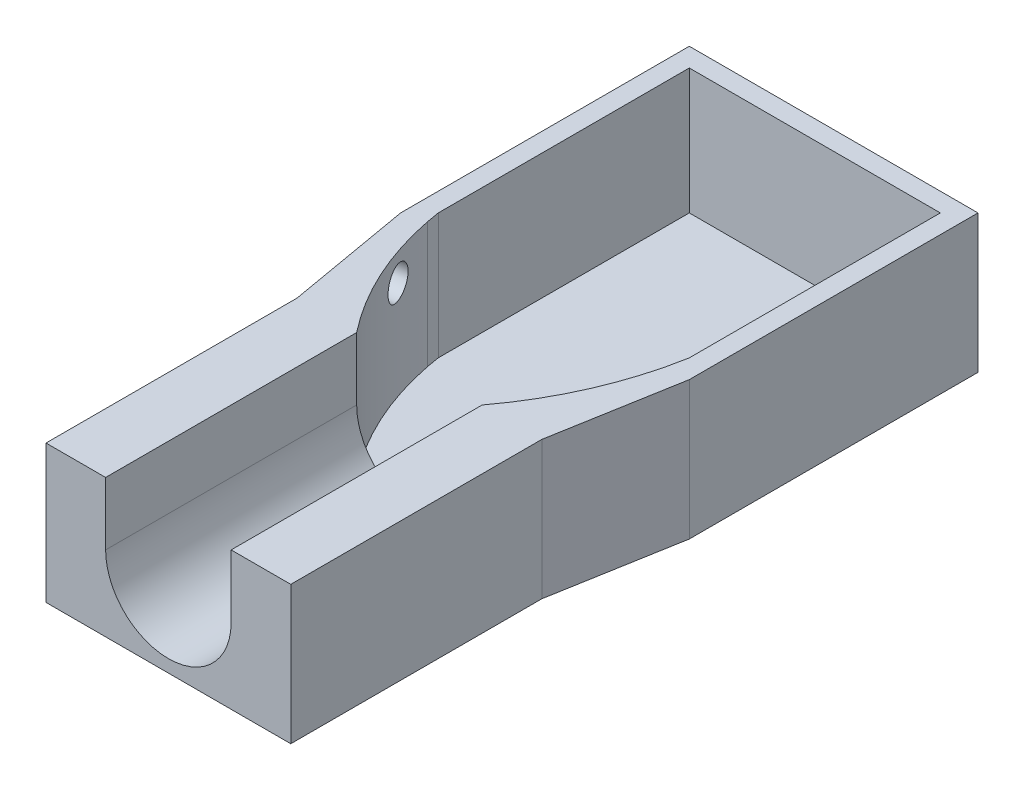
ISO-10303-21;
HEADER;
FILE_DESCRIPTION(('STEP AP214'),'2;1');
FILE_NAME('part.step','',(''),(''),'','','');
FILE_SCHEMA(('AUTOMOTIVE_DESIGN { 1 0 10303 214 1 1 1 1 }'));
ENDSEC;
DATA;
#1=APPLICATION_CONTEXT('core data for automotive mechanical design processes');
#2=APPLICATION_PROTOCOL_DEFINITION('international standard','automotive_design',2000,#1);
#3=PRODUCT_CONTEXT('',#1,'mechanical');
#4=PRODUCT('Part','Part','',(#3));
#5=PRODUCT_RELATED_PRODUCT_CATEGORY('part','',(#4));
#6=PRODUCT_DEFINITION_FORMATION('','',#4);
#7=PRODUCT_DEFINITION_CONTEXT('part definition',#1,'design');
#8=PRODUCT_DEFINITION('design','',#6,#7);
#9=PRODUCT_DEFINITION_SHAPE('','',#8);
#10=(LENGTH_UNIT() NAMED_UNIT(*) SI_UNIT(.MILLI.,.METRE.));
#11=(NAMED_UNIT(*) PLANE_ANGLE_UNIT() SI_UNIT($,.RADIAN.));
#12=(NAMED_UNIT(*) SI_UNIT($,.STERADIAN.) SOLID_ANGLE_UNIT());
#13=UNCERTAINTY_MEASURE_WITH_UNIT(LENGTH_MEASURE(1.E-05),#10,'distance_accuracy_value','');
#14=(GEOMETRIC_REPRESENTATION_CONTEXT(3) GLOBAL_UNCERTAINTY_ASSIGNED_CONTEXT((#13)) GLOBAL_UNIT_ASSIGNED_CONTEXT((#10,
#11,#12)) REPRESENTATION_CONTEXT('',''));
#15=CARTESIAN_POINT('',(0.,0.,0.));
#16=DIRECTION('',(0.,0.,1.));
#17=DIRECTION('',(1.,0.,0.));
#18=AXIS2_PLACEMENT_3D('',#15,#16,#17);
#19=CARTESIAN_POINT('',(0.,0.,0.));
#20=DIRECTION('',(0.,1.,0.));
#21=DIRECTION('',(0.,0.,1.));
#22=AXIS2_PLACEMENT_3D('',#19,#20,#21);
#23=PLANE('',#22);
#24=CARTESIAN_POINT('',(-33.1294989342735,0.,10.574130898142));
#25=DIRECTION('',(0.,1.,0.));
#26=DIRECTION('',(0.,0.,1.));
#27=AXIS2_PLACEMENT_3D('',#24,#25,#26);
#28=CIRCLE('',#27,53.9591573816005);
#29=CARTESIAN_POINT('',(20.,0.,20.));
#30=VERTEX_POINT('',#29);
#31=CARTESIAN_POINT('',(10.,0.,43.));
#32=VERTEX_POINT('',#31);
#33=EDGE_CURVE('E195',#30,#32,#28,.F.);
#34=ORIENTED_EDGE('',*,*,#33,.F.);
#35=DIRECTION('',(0.,0.,-1.));
#36=VECTOR('',#35,1.);
#37=CARTESIAN_POINT('',(20.,0.,-20.));
#38=LINE('',#37,#36);
#39=CARTESIAN_POINT('',(20.,0.,-20.));
#40=VERTEX_POINT('',#39);
#41=EDGE_CURVE('E286',#30,#40,#38,.T.);
#42=ORIENTED_EDGE('',*,*,#41,.T.);
#43=DIRECTION('',(-1.,0.,0.));
#44=VECTOR('',#43,1.);
#45=CARTESIAN_POINT('',(-20.,0.,-20.));
#46=LINE('',#45,#44);
#47=CARTESIAN_POINT('',(-20.,0.,-20.));
#48=VERTEX_POINT('',#47);
#49=EDGE_CURVE('E297',#40,#48,#46,.T.);
#50=ORIENTED_EDGE('',*,*,#49,.T.);
#51=DIRECTION('',(0.,0.,1.));
#52=VECTOR('',#51,1.);
#53=CARTESIAN_POINT('',(-20.,0.,-20.));
#54=LINE('',#53,#52);
#55=CARTESIAN_POINT('',(-20.,0.,20.));
#56=VERTEX_POINT('',#55);
#57=EDGE_CURVE('E289',#48,#56,#54,.T.);
#58=ORIENTED_EDGE('',*,*,#57,.T.);
#59=DIRECTION('',(0.171341174751248,0.,0.985211754819675));
#60=VECTOR('',#59,1.);
#61=CARTESIAN_POINT('',(-22.7889908256881,0.,3.96330275229359));
#62=LINE('',#61,#60);
#63=CARTESIAN_POINT('',(-19.6470931870263,0.,22.0292141745987));
#64=VERTEX_POINT('',#63);
#65=EDGE_CURVE('E256',#56,#64,#62,.T.);
#66=ORIENTED_EDGE('',*,*,#65,.T.);
#67=CARTESIAN_POINT('',(28.4097038943594,0.,12.6262156981042));
#68=DIRECTION('',(0.,1.,0.));
#69=DIRECTION('',(0.,0.,1.));
#70=AXIS2_PLACEMENT_3D('',#67,#68,#69);
#71=CIRCLE('',#70,48.9680725174112);
#72=CARTESIAN_POINT('',(-9.99999999999787,0.,43.));
#73=VERTEX_POINT('',#72);
#74=EDGE_CURVE('E204',#64,#73,#71,.T.);
#75=ORIENTED_EDGE('',*,*,#74,.T.);
#76=DIRECTION('',(-1.,0.,0.));
#77=VECTOR('',#76,1.);
#78=CARTESIAN_POINT('',(16.,0.,43.));
#79=LINE('',#78,#77);
#80=CARTESIAN_POINT('',(1.59588101442073E-12,0.,43.));
#81=VERTEX_POINT('',#80);
#82=EDGE_CURVE('E254',#81,#73,#79,.T.);
#83=ORIENTED_EDGE('',*,*,#82,.F.);
#84=EDGE_CURVE('E61',#32,#81,#79,.T.);
#85=ORIENTED_EDGE('',*,*,#84,.F.);
#86=EDGE_LOOP('',(#34,#42,#50,#58,#66,#75,#83,#85));
#87=FACE_BOUND('',#86,.T.);
#88=ADVANCED_FACE('F37',(#87),#23,.T.);
#89=CARTESIAN_POINT('',(-22.7889908256881,-2.,3.96330275229359));
#90=DIRECTION('',(-0.985211754819675,0.,0.171341174751248));
#91=DIRECTION('',(0.171341174751248,0.,0.985211754819674));
#92=AXIS2_PLACEMENT_3D('',#89,#90,#91);
#93=PLANE('',#92);
#94=DIRECTION('',(0.,1.,0.));
#95=VECTOR('',#94,1.);
#96=CARTESIAN_POINT('',(-19.6470931870263,0.,22.0292141745987));
#97=LINE('',#96,#95);
#98=CARTESIAN_POINT('',(-19.6470931870263,20.,22.0292141745987));
#99=VERTEX_POINT('',#98);
#100=EDGE_CURVE('E207',#64,#99,#97,.T.);
#101=ORIENTED_EDGE('',*,*,#100,.F.);
#102=ORIENTED_EDGE('',*,*,#65,.F.);
#103=DIRECTION('',(0.,-1.,0.));
#104=VECTOR('',#103,1.);
#105=CARTESIAN_POINT('',(-20.,20.,20.));
#106=LINE('',#105,#104);
#107=CARTESIAN_POINT('',(-20.,20.,20.));
#108=VERTEX_POINT('',#107);
#109=EDGE_CURVE('E303',#108,#56,#106,.T.);
#110=ORIENTED_EDGE('',*,*,#109,.F.);
#111=DIRECTION('',(0.171341174751248,0.,0.985211754819675));
#112=VECTOR('',#111,1.);
#113=CARTESIAN_POINT('',(-22.7889908256881,20.,3.96330275229359));
#114=LINE('',#113,#112);
#115=EDGE_CURVE('E271',#108,#99,#114,.T.);
#116=ORIENTED_EDGE('',*,*,#115,.T.);
#117=EDGE_LOOP('',(#101,#102,#110,#116));
#118=FACE_BOUND('',#117,.T.);
#119=ADVANCED_FACE('F368',(#118),#93,.F.);
#120=CARTESIAN_POINT('',(0.,0.,43.));
#121=DIRECTION('',(0.,0.,1.));
#122=DIRECTION('',(1.,0.,0.));
#123=AXIS2_PLACEMENT_3D('',#120,#121,#122);
#124=PLANE('',#123);
#125=DIRECTION('',(0.,1.,0.));
#126=VECTOR('',#125,1.);
#127=CARTESIAN_POINT('',(-9.99999999999787,0.,43.));
#128=LINE('',#127,#126);
#129=CARTESIAN_POINT('',(-9.99999999999787,10.0000000000005,43.));
#130=VERTEX_POINT('',#129);
#131=EDGE_CURVE('E188',#73,#130,#128,.T.);
#132=ORIENTED_EDGE('',*,*,#131,.T.);
#133=CARTESIAN_POINT('',(1.59588101442073E-12,10.0000000000005,43.));
#134=DIRECTION('',(0.,0.,1.));
#135=DIRECTION('',(1.,0.,0.));
#136=AXIS2_PLACEMENT_3D('',#133,#134,#135);
#137=CIRCLE('',#136,10.0000000000007);
#138=EDGE_CURVE('E231',#130,#81,#137,.T.);
#139=ORIENTED_EDGE('',*,*,#138,.T.);
#140=ORIENTED_EDGE('',*,*,#82,.T.);
#141=EDGE_LOOP('',(#132,#139,#140));
#142=FACE_BOUND('',#141,.T.);
#143=ADVANCED_FACE('F386',(#142),#124,.F.);
#144=CARTESIAN_POINT('',(0.,20.,0.));
#145=DIRECTION('',(0.,1.,0.));
#146=DIRECTION('',(0.,0.,1.));
#147=AXIS2_PLACEMENT_3D('',#144,#145,#146);
#148=PLANE('',#147);
#149=CARTESIAN_POINT('',(28.4097038943594,20.,12.6262156981042));
#150=DIRECTION('',(0.,1.,0.));
#151=DIRECTION('',(0.,0.,1.));
#152=AXIS2_PLACEMENT_3D('',#149,#150,#151);
#153=CIRCLE('',#152,48.9680725174112);
#154=CARTESIAN_POINT('',(-9.99999999999787,20.,43.));
#155=VERTEX_POINT('',#154);
#156=EDGE_CURVE('E203',#99,#155,#153,.T.);
#157=ORIENTED_EDGE('',*,*,#156,.F.);
#158=ORIENTED_EDGE('',*,*,#115,.F.);
#159=DIRECTION('',(0.,0.,1.));
#160=VECTOR('',#159,1.);
#161=CARTESIAN_POINT('',(-20.,20.,-20.));
#162=LINE('',#161,#160);
#163=CARTESIAN_POINT('',(-20.,20.,-20.));
#164=VERTEX_POINT('',#163);
#165=EDGE_CURVE('E291',#164,#108,#162,.T.);
#166=ORIENTED_EDGE('',*,*,#165,.F.);
#167=DIRECTION('',(-1.,0.,0.));
#168=VECTOR('',#167,1.);
#169=CARTESIAN_POINT('',(-20.,20.,-20.));
#170=LINE('',#169,#168);
#171=CARTESIAN_POINT('',(20.,20.,-20.));
#172=VERTEX_POINT('',#171);
#173=EDGE_CURVE('E288',#172,#164,#170,.T.);
#174=ORIENTED_EDGE('',*,*,#173,.F.);
#175=DIRECTION('',(0.,0.,-1.));
#176=VECTOR('',#175,1.);
#177=CARTESIAN_POINT('',(20.,20.,-20.));
#178=LINE('',#177,#176);
#179=CARTESIAN_POINT('',(20.,20.,20.));
#180=VERTEX_POINT('',#179);
#181=EDGE_CURVE('E194',#180,#172,#178,.T.);
#182=ORIENTED_EDGE('',*,*,#181,.F.);
#183=CARTESIAN_POINT('',(-33.1294989342735,20.,10.574130898142));
#184=DIRECTION('',(0.,1.,0.));
#185=DIRECTION('',(0.,0.,1.));
#186=AXIS2_PLACEMENT_3D('',#183,#184,#185);
#187=CIRCLE('',#186,53.9591573816005);
#188=CARTESIAN_POINT('',(10.,20.,43.));
#189=VERTEX_POINT('',#188);
#190=EDGE_CURVE('E185',#180,#189,#187,.F.);
#191=ORIENTED_EDGE('',*,*,#190,.T.);
#192=DIRECTION('',(0.,0.,-1.));
#193=VECTOR('',#192,1.);
#194=CARTESIAN_POINT('',(10.,20.,83.));
#195=LINE('',#194,#193);
#196=CARTESIAN_POINT('',(10.,20.,83.));
#197=VERTEX_POINT('',#196);
#198=EDGE_CURVE('E169',#197,#189,#195,.T.);
#199=ORIENTED_EDGE('',*,*,#198,.F.);
#200=DIRECTION('',(-1.,0.,0.));
#201=VECTOR('',#200,1.);
#202=CARTESIAN_POINT('',(0.,20.,83.));
#203=LINE('',#202,#201);
#204=CARTESIAN_POINT('',(19.5,20.,83.));
#205=VERTEX_POINT('',#204);
#206=EDGE_CURVE('E222',#205,#197,#203,.T.);
#207=ORIENTED_EDGE('',*,*,#206,.F.);
#208=DIRECTION('',(0.,0.,-1.));
#209=VECTOR('',#208,1.);
#210=CARTESIAN_POINT('',(19.5,20.,83.));
#211=LINE('',#210,#209);
#212=CARTESIAN_POINT('',(19.5,20.,43.));
#213=VERTEX_POINT('',#212);
#214=EDGE_CURVE('E178',#205,#213,#211,.T.);
#215=ORIENTED_EDGE('',*,*,#214,.T.);
#216=DIRECTION('',(0.172380331752248,0.,-0.985030467155704));
#217=VECTOR('',#216,1.);
#218=CARTESIAN_POINT('',(26.2219526986052,20.,4.58884172225589));
#219=LINE('',#218,#217);
#220=CARTESIAN_POINT('',(23.,20.,23.));
#221=VERTEX_POINT('',#220);
#222=EDGE_CURVE('E259',#213,#221,#219,.T.);
#223=ORIENTED_EDGE('',*,*,#222,.T.);
#224=DIRECTION('',(0.,0.,-1.));
#225=VECTOR('',#224,1.);
#226=CARTESIAN_POINT('',(23.,20.,-23.));
#227=LINE('',#226,#225);
#228=CARTESIAN_POINT('',(23.,20.,-23.));
#229=VERTEX_POINT('',#228);
#230=EDGE_CURVE('E311',#221,#229,#227,.T.);
#231=ORIENTED_EDGE('',*,*,#230,.T.);
#232=DIRECTION('',(-1.,0.,0.));
#233=VECTOR('',#232,1.);
#234=CARTESIAN_POINT('',(-23.,20.,-23.));
#235=LINE('',#234,#233);
#236=CARTESIAN_POINT('',(-23.,20.,-23.));
#237=VERTEX_POINT('',#236);
#238=EDGE_CURVE('E314',#229,#237,#235,.T.);
#239=ORIENTED_EDGE('',*,*,#238,.T.);
#240=DIRECTION('',(0.,0.,1.));
#241=VECTOR('',#240,1.);
#242=CARTESIAN_POINT('',(-23.,20.,-23.));
#243=LINE('',#242,#241);
#244=CARTESIAN_POINT('',(-23.,20.,23.));
#245=VERTEX_POINT('',#244);
#246=EDGE_CURVE('E316',#237,#245,#243,.T.);
#247=ORIENTED_EDGE('',*,*,#246,.T.);
#248=DIRECTION('',(0.172380331752249,0.,0.985030467155704));
#249=VECTOR('',#248,1.);
#250=CARTESIAN_POINT('',(-26.2219526986052,20.,4.58884172225593));
#251=LINE('',#250,#249);
#252=CARTESIAN_POINT('',(-19.5,20.,43.));
#253=VERTEX_POINT('',#252);
#254=EDGE_CURVE('E267',#245,#253,#251,.T.);
#255=ORIENTED_EDGE('',*,*,#254,.T.);
#256=DIRECTION('',(0.,0.,-1.));
#257=VECTOR('',#256,1.);
#258=CARTESIAN_POINT('',(-19.5,20.,83.));
#259=LINE('',#258,#257);
#260=CARTESIAN_POINT('',(-19.5,20.,83.));
#261=VERTEX_POINT('',#260);
#262=EDGE_CURVE('E251',#261,#253,#259,.T.);
#263=ORIENTED_EDGE('',*,*,#262,.F.);
#264=DIRECTION('',(-1.,0.,0.));
#265=VECTOR('',#264,1.);
#266=CARTESIAN_POINT('',(0.,20.,83.));
#267=LINE('',#266,#265);
#268=CARTESIAN_POINT('',(-9.99999999999787,20.,83.));
#269=VERTEX_POINT('',#268);
#270=EDGE_CURVE('E212',#269,#261,#267,.T.);
#271=ORIENTED_EDGE('',*,*,#270,.F.);
#272=DIRECTION('',(0.,0.,-1.));
#273=VECTOR('',#272,1.);
#274=CARTESIAN_POINT('',(-9.99999999999787,20.,83.));
#275=LINE('',#274,#273);
#276=EDGE_CURVE('E229',#269,#155,#275,.T.);
#277=ORIENTED_EDGE('',*,*,#276,.T.);
#278=EDGE_LOOP('',(#157,#158,#166,#174,#182,#191,#199,#207,#215,#223,#231,#239,#247,#255,#263,
#271,#277));
#279=FACE_BOUND('',#278,.T.);
#280=ADVANCED_FACE('F192',(#279),#148,.T.);
#281=CARTESIAN_POINT('',(23.,20.,-23.));
#282=DIRECTION('',(-1.,0.,0.));
#283=DIRECTION('',(0.,0.,1.));
#284=AXIS2_PLACEMENT_3D('',#281,#282,#283);
#285=PLANE('',#284);
#286=DIRECTION('',(0.,-1.,0.));
#287=VECTOR('',#286,1.);
#288=CARTESIAN_POINT('',(23.,20.,23.));
#289=LINE('',#288,#287);
#290=CARTESIAN_POINT('',(23.,-2.,23.));
#291=VERTEX_POINT('',#290);
#292=EDGE_CURVE('E318',#221,#291,#289,.T.);
#293=ORIENTED_EDGE('',*,*,#292,.T.);
#294=DIRECTION('',(0.,0.,1.));
#295=VECTOR('',#294,1.);
#296=CARTESIAN_POINT('',(23.,-2.,-23.));
#297=LINE('',#296,#295);
#298=CARTESIAN_POINT('',(23.,-2.,-23.));
#299=VERTEX_POINT('',#298);
#300=EDGE_CURVE('E283',#299,#291,#297,.T.);
#301=ORIENTED_EDGE('',*,*,#300,.F.);
#302=DIRECTION('',(0.,-1.,0.));
#303=VECTOR('',#302,1.);
#304=CARTESIAN_POINT('',(23.,20.,-23.));
#305=LINE('',#304,#303);
#306=EDGE_CURVE('E11',#229,#299,#305,.T.);
#307=ORIENTED_EDGE('',*,*,#306,.F.);
#308=ORIENTED_EDGE('',*,*,#230,.F.);
#309=EDGE_LOOP('',(#293,#301,#307,#308));
#310=FACE_BOUND('',#309,.T.);
#311=ADVANCED_FACE('F39',(#310),#285,.F.);
#312=CARTESIAN_POINT('',(-23.,20.,-23.));
#313=DIRECTION('',(0.,0.,1.));
#314=DIRECTION('',(1.,0.,0.));
#315=AXIS2_PLACEMENT_3D('',#312,#313,#314);
#316=PLANE('',#315);
#317=ORIENTED_EDGE('',*,*,#306,.T.);
#318=DIRECTION('',(1.,0.,0.));
#319=VECTOR('',#318,1.);
#320=CARTESIAN_POINT('',(-23.,-2.,-23.));
#321=LINE('',#320,#319);
#322=CARTESIAN_POINT('',(-23.,-2.,-23.));
#323=VERTEX_POINT('',#322);
#324=EDGE_CURVE('E280',#323,#299,#321,.T.);
#325=ORIENTED_EDGE('',*,*,#324,.F.);
#326=DIRECTION('',(0.,-1.,0.));
#327=VECTOR('',#326,1.);
#328=CARTESIAN_POINT('',(-23.,20.,-23.));
#329=LINE('',#328,#327);
#330=EDGE_CURVE('E51',#237,#323,#329,.T.);
#331=ORIENTED_EDGE('',*,*,#330,.F.);
#332=ORIENTED_EDGE('',*,*,#238,.F.);
#333=EDGE_LOOP('',(#317,#325,#331,#332));
#334=FACE_BOUND('',#333,.T.);
#335=ADVANCED_FACE('F331',(#334),#316,.F.);
#336=CARTESIAN_POINT('',(-23.,20.,-23.));
#337=DIRECTION('',(1.,0.,0.));
#338=DIRECTION('',(0.,0.,-1.));
#339=AXIS2_PLACEMENT_3D('',#336,#337,#338);
#340=PLANE('',#339);
#341=ORIENTED_EDGE('',*,*,#330,.T.);
#342=DIRECTION('',(0.,0.,-1.));
#343=VECTOR('',#342,1.);
#344=CARTESIAN_POINT('',(-23.,-2.,-23.));
#345=LINE('',#344,#343);
#346=CARTESIAN_POINT('',(-23.,-2.,23.));
#347=VERTEX_POINT('',#346);
#348=EDGE_CURVE('E277',#347,#323,#345,.T.);
#349=ORIENTED_EDGE('',*,*,#348,.F.);
#350=DIRECTION('',(0.,-1.,0.));
#351=VECTOR('',#350,1.);
#352=CARTESIAN_POINT('',(-23.,20.,23.));
#353=LINE('',#352,#351);
#354=EDGE_CURVE('E321',#245,#347,#353,.T.);
#355=ORIENTED_EDGE('',*,*,#354,.F.);
#356=ORIENTED_EDGE('',*,*,#246,.F.);
#357=EDGE_LOOP('',(#341,#349,#355,#356));
#358=FACE_BOUND('',#357,.T.);
#359=ADVANCED_FACE('F328',(#358),#340,.F.);
#360=CARTESIAN_POINT('',(20.,20.,-20.));
#361=DIRECTION('',(-1.,0.,0.));
#362=DIRECTION('',(0.,0.,1.));
#363=AXIS2_PLACEMENT_3D('',#360,#361,#362);
#364=PLANE('',#363);
#365=ORIENTED_EDGE('',*,*,#41,.F.);
#366=DIRECTION('',(0.,-1.,0.));
#367=VECTOR('',#366,1.);
#368=CARTESIAN_POINT('',(20.,20.,20.));
#369=LINE('',#368,#367);
#370=EDGE_CURVE('E294',#180,#30,#369,.T.);
#371=ORIENTED_EDGE('',*,*,#370,.F.);
#372=ORIENTED_EDGE('',*,*,#181,.T.);
#373=DIRECTION('',(0.,-1.,0.));
#374=VECTOR('',#373,1.);
#375=CARTESIAN_POINT('',(20.,20.,-20.));
#376=LINE('',#375,#374);
#377=EDGE_CURVE('E308',#172,#40,#376,.T.);
#378=ORIENTED_EDGE('',*,*,#377,.T.);
#379=EDGE_LOOP('',(#365,#371,#372,#378));
#380=FACE_BOUND('',#379,.T.);
#381=ADVANCED_FACE('F378',(#380),#364,.T.);
#382=CARTESIAN_POINT('',(-20.,20.,-20.));
#383=DIRECTION('',(0.,0.,1.));
#384=DIRECTION('',(1.,0.,0.));
#385=AXIS2_PLACEMENT_3D('',#382,#383,#384);
#386=PLANE('',#385);
#387=ORIENTED_EDGE('',*,*,#49,.F.);
#388=ORIENTED_EDGE('',*,*,#377,.F.);
#389=ORIENTED_EDGE('',*,*,#173,.T.);
#390=DIRECTION('',(0.,-1.,0.));
#391=VECTOR('',#390,1.);
#392=CARTESIAN_POINT('',(-20.,20.,-20.));
#393=LINE('',#392,#391);
#394=EDGE_CURVE('E306',#164,#48,#393,.T.);
#395=ORIENTED_EDGE('',*,*,#394,.T.);
#396=EDGE_LOOP('',(#387,#388,#389,#395));
#397=FACE_BOUND('',#396,.T.);
#398=ADVANCED_FACE('F375',(#397),#386,.T.);
#399=CARTESIAN_POINT('',(-20.,20.,-20.));
#400=DIRECTION('',(1.,0.,0.));
#401=DIRECTION('',(0.,0.,-1.));
#402=AXIS2_PLACEMENT_3D('',#399,#400,#401);
#403=PLANE('',#402);
#404=ORIENTED_EDGE('',*,*,#57,.F.);
#405=ORIENTED_EDGE('',*,*,#394,.F.);
#406=ORIENTED_EDGE('',*,*,#165,.T.);
#407=ORIENTED_EDGE('',*,*,#109,.T.);
#408=EDGE_LOOP('',(#404,#405,#406,#407));
#409=FACE_BOUND('',#408,.T.);
#410=ADVANCED_FACE('F372',(#409),#403,.T.);
#411=CARTESIAN_POINT('',(0.,-2.,0.));
#412=DIRECTION('',(0.,1.,0.));
#413=DIRECTION('',(0.,0.,1.));
#414=AXIS2_PLACEMENT_3D('',#411,#412,#413);
#415=PLANE('',#414);
#416=DIRECTION('',(0.172380331752248,0.,-0.985030467155704));
#417=VECTOR('',#416,1.);
#418=CARTESIAN_POINT('',(26.2219526986052,-2.,4.58884172225589));
#419=LINE('',#418,#417);
#420=CARTESIAN_POINT('',(19.5,-2.,43.));
#421=VERTEX_POINT('',#420);
#422=EDGE_CURVE('E260',#421,#291,#419,.T.);
#423=ORIENTED_EDGE('',*,*,#422,.F.);
#424=DIRECTION('',(0.,0.,-1.));
#425=VECTOR('',#424,1.);
#426=CARTESIAN_POINT('',(19.5,-2.,83.));
#427=LINE('',#426,#425);
#428=CARTESIAN_POINT('',(19.5,-2.,83.));
#429=VERTEX_POINT('',#428);
#430=EDGE_CURVE('E245',#429,#421,#427,.T.);
#431=ORIENTED_EDGE('',*,*,#430,.F.);
#432=DIRECTION('',(1.,0.,0.));
#433=VECTOR('',#432,1.);
#434=CARTESIAN_POINT('',(0.,-2.,83.));
#435=LINE('',#434,#433);
#436=CARTESIAN_POINT('',(-19.5,-2.,83.));
#437=VERTEX_POINT('',#436);
#438=EDGE_CURVE('E218',#437,#429,#435,.T.);
#439=ORIENTED_EDGE('',*,*,#438,.F.);
#440=DIRECTION('',(0.,0.,-1.));
#441=VECTOR('',#440,1.);
#442=CARTESIAN_POINT('',(-19.5,-2.,83.));
#443=LINE('',#442,#441);
#444=CARTESIAN_POINT('',(-19.5,-2.,43.));
#445=VERTEX_POINT('',#444);
#446=EDGE_CURVE('E248',#437,#445,#443,.T.);
#447=ORIENTED_EDGE('',*,*,#446,.T.);
#448=DIRECTION('',(0.172380331752249,0.,0.985030467155704));
#449=VECTOR('',#448,1.);
#450=CARTESIAN_POINT('',(-26.2219526986052,-2.,4.58884172225593));
#451=LINE('',#450,#449);
#452=EDGE_CURVE('E268',#347,#445,#451,.T.);
#453=ORIENTED_EDGE('',*,*,#452,.F.);
#454=ORIENTED_EDGE('',*,*,#348,.T.);
#455=ORIENTED_EDGE('',*,*,#324,.T.);
#456=ORIENTED_EDGE('',*,*,#300,.T.);
#457=EDGE_LOOP('',(#423,#431,#439,#447,#453,#454,#455,#456));
#458=FACE_BOUND('',#457,.T.);
#459=ADVANCED_FACE('F337',(#458),#415,.F.);
#460=CARTESIAN_POINT('',(-26.2219526986052,-2.,4.58884172225593));
#461=DIRECTION('',(-0.985030467155704,0.,0.172380331752249));
#462=DIRECTION('',(0.172380331752249,0.,0.985030467155704));
#463=AXIS2_PLACEMENT_3D('',#460,#461,#462);
#464=PLANE('',#463);
#465=CARTESIAN_POINT('',(-21.8956647663987,15.7053469398435,29.3104870491506));
#466=DIRECTION('',(-0.985030467155704,0.,0.172380331752249));
#467=DIRECTION('',(0.172380331752249,0.,0.985030467155704));
#468=AXIS2_PLACEMENT_3D('',#465,#466,#467);
#469=CIRCLE('',#468,2.55);
#470=CARTESIAN_POINT('',(-21.4560949204304,15.7053469398435,31.8223147403976));
#471=VERTEX_POINT('',#470);
#472=EDGE_CURVE('E199',#471,#471,#469,.T.);
#473=ORIENTED_EDGE('',*,*,#472,.F.);
#474=EDGE_LOOP('',(#473));
#475=FACE_BOUND('',#474,.T.);
#476=ORIENTED_EDGE('',*,*,#254,.F.);
#477=ORIENTED_EDGE('',*,*,#354,.T.);
#478=ORIENTED_EDGE('',*,*,#452,.T.);
#479=DIRECTION('',(0.,1.,0.));
#480=VECTOR('',#479,1.);
#481=CARTESIAN_POINT('',(-19.5,-2.,43.));
#482=LINE('',#481,#480);
#483=EDGE_CURVE('E270',#445,#253,#482,.T.);
#484=ORIENTED_EDGE('',*,*,#483,.T.);
#485=EDGE_LOOP('',(#476,#477,#478,#484));
#486=FACE_BOUND('',#485,.T.);
#487=ADVANCED_FACE('F343',(#475,#486),#464,.T.);
#488=CARTESIAN_POINT('',(26.2219526986052,-2.,4.58884172225589));
#489=DIRECTION('',(0.985030467155704,0.,0.172380331752248));
#490=DIRECTION('',(0.172380331752248,0.,-0.985030467155704));
#491=AXIS2_PLACEMENT_3D('',#488,#489,#490);
#492=PLANE('',#491);
#493=ORIENTED_EDGE('',*,*,#222,.F.);
#494=DIRECTION('',(0.,1.,0.));
#495=VECTOR('',#494,1.);
#496=CARTESIAN_POINT('',(19.5,-2.,43.));
#497=LINE('',#496,#495);
#498=EDGE_CURVE('E262',#421,#213,#497,.T.);
#499=ORIENTED_EDGE('',*,*,#498,.F.);
#500=ORIENTED_EDGE('',*,*,#422,.T.);
#501=ORIENTED_EDGE('',*,*,#292,.F.);
#502=EDGE_LOOP('',(#493,#499,#500,#501));
#503=FACE_BOUND('',#502,.T.);
#504=ADVANCED_FACE('F482',(#503),#492,.T.);
#505=CARTESIAN_POINT('',(10.0000000000019,10.0000000000011,43.));
#506=VERTEX_POINT('',#505);
#507=EDGE_CURVE('E187',#81,#506,#137,.T.);
#508=ORIENTED_EDGE('',*,*,#507,.T.);
#509=DIRECTION('',(0.,1.,0.));
#510=VECTOR('',#509,1.);
#511=CARTESIAN_POINT('',(10.,0.,43.));
#512=LINE('',#511,#510);
#513=EDGE_CURVE('E58',#32,#506,#512,.T.);
#514=ORIENTED_EDGE('',*,*,#513,.F.);
#515=ORIENTED_EDGE('',*,*,#84,.T.);
#516=EDGE_LOOP('',(#508,#514,#515));
#517=FACE_BOUND('',#516,.T.);
#518=ADVANCED_FACE('F435',(#517),#124,.F.);
#519=CARTESIAN_POINT('',(-19.5,0.,83.));
#520=DIRECTION('',(1.,0.,0.));
#521=DIRECTION('',(0.,0.,-1.));
#522=AXIS2_PLACEMENT_3D('',#519,#520,#521);
#523=PLANE('',#522);
#524=ORIENTED_EDGE('',*,*,#483,.F.);
#525=ORIENTED_EDGE('',*,*,#446,.F.);
#526=DIRECTION('',(0.,-1.,0.));
#527=VECTOR('',#526,1.);
#528=CARTESIAN_POINT('',(-19.5,0.,83.));
#529=LINE('',#528,#527);
#530=EDGE_CURVE('E215',#261,#437,#529,.T.);
#531=ORIENTED_EDGE('',*,*,#530,.F.);
#532=ORIENTED_EDGE('',*,*,#262,.T.);
#533=EDGE_LOOP('',(#524,#525,#531,#532));
#534=FACE_BOUND('',#533,.T.);
#535=ADVANCED_FACE('F345',(#534),#523,.F.);
#536=CARTESIAN_POINT('',(19.5,0.,83.));
#537=DIRECTION('',(-1.,0.,0.));
#538=DIRECTION('',(0.,0.,1.));
#539=AXIS2_PLACEMENT_3D('',#536,#537,#538);
#540=PLANE('',#539);
#541=ORIENTED_EDGE('',*,*,#498,.T.);
#542=ORIENTED_EDGE('',*,*,#214,.F.);
#543=DIRECTION('',(0.,1.,0.));
#544=VECTOR('',#543,1.);
#545=CARTESIAN_POINT('',(19.5,0.,83.));
#546=LINE('',#545,#544);
#547=EDGE_CURVE('E220',#429,#205,#546,.T.);
#548=ORIENTED_EDGE('',*,*,#547,.F.);
#549=ORIENTED_EDGE('',*,*,#430,.T.);
#550=EDGE_LOOP('',(#541,#542,#548,#549));
#551=FACE_BOUND('',#550,.T.);
#552=ADVANCED_FACE('F354',(#551),#540,.F.);
#553=CARTESIAN_POINT('',(10.0000000000037,1.86829718362792E-12,83.));
#554=DIRECTION('',(-1.,-1.86829718362722E-13,0.));
#555=DIRECTION('',(1.86829718362722E-13,-1.,0.));
#556=AXIS2_PLACEMENT_3D('',#553,#554,#555);
#557=PLANE('',#556);
#558=DIRECTION('',(-1.86829718362722E-13,1.,0.));
#559=VECTOR('',#558,1.);
#560=CARTESIAN_POINT('',(10.0000000000037,1.86829718362792E-12,43.));
#561=LINE('',#560,#559);
#562=EDGE_CURVE('E172',#506,#189,#561,.T.);
#563=ORIENTED_EDGE('',*,*,#562,.F.);
#564=DIRECTION('',(0.,0.,-1.));
#565=VECTOR('',#564,1.);
#566=CARTESIAN_POINT('',(10.0000000000019,10.0000000000011,83.));
#567=LINE('',#566,#565);
#568=CARTESIAN_POINT('',(10.0000000000019,10.0000000000011,83.));
#569=VERTEX_POINT('',#568);
#570=EDGE_CURVE('E179',#569,#506,#567,.T.);
#571=ORIENTED_EDGE('',*,*,#570,.F.);
#572=DIRECTION('',(-1.86829718362722E-13,1.,0.));
#573=VECTOR('',#572,1.);
#574=CARTESIAN_POINT('',(10.0000000000037,1.86829718362792E-12,83.));
#575=LINE('',#574,#573);
#576=EDGE_CURVE('E174',#569,#197,#575,.T.);
#577=ORIENTED_EDGE('',*,*,#576,.T.);
#578=ORIENTED_EDGE('',*,*,#198,.T.);
#579=EDGE_LOOP('',(#563,#571,#577,#578));
#580=FACE_BOUND('',#579,.T.);
#581=ADVANCED_FACE('F171',(#580),#557,.T.);
#582=CARTESIAN_POINT('',(1.59588101442073E-12,10.0000000000005,83.));
#583=DIRECTION('',(0.,0.,-1.));
#584=DIRECTION('',(-1.,0.,0.));
#585=AXIS2_PLACEMENT_3D('',#582,#583,#584);
#586=CYLINDRICAL_SURFACE('',#585,10.0000000000007);
#587=ORIENTED_EDGE('',*,*,#138,.F.);
#588=DIRECTION('',(0.,0.,-1.));
#589=VECTOR('',#588,1.);
#590=CARTESIAN_POINT('',(-9.99999999999975,10.0000000000005,83.));
#591=LINE('',#590,#589);
#592=CARTESIAN_POINT('',(-9.99999999999975,10.0000000000005,83.));
#593=VERTEX_POINT('',#592);
#594=EDGE_CURVE('E238',#593,#130,#591,.T.);
#595=ORIENTED_EDGE('',*,*,#594,.F.);
#596=CARTESIAN_POINT('',(1.59588101442073E-12,10.0000000000005,83.));
#597=DIRECTION('',(0.,0.,1.));
#598=DIRECTION('',(1.,0.,0.));
#599=AXIS2_PLACEMENT_3D('',#596,#597,#598);
#600=CIRCLE('',#599,10.0000000000007);
#601=EDGE_CURVE('E225',#593,#569,#600,.T.);
#602=ORIENTED_EDGE('',*,*,#601,.T.);
#603=ORIENTED_EDGE('',*,*,#570,.T.);
#604=ORIENTED_EDGE('',*,*,#507,.F.);
#605=EDGE_LOOP('',(#587,#595,#602,#603,#604));
#606=FACE_BOUND('',#605,.T.);
#607=ADVANCED_FACE('F385',(#606),#586,.F.);
#608=CARTESIAN_POINT('',(-10.0000000000016,1.87176663057938E-12,83.));
#609=DIRECTION('',(-1.,1.87176663057908E-13,0.));
#610=DIRECTION('',(-1.87176663057908E-13,-1.,0.));
#611=AXIS2_PLACEMENT_3D('',#608,#609,#610);
#612=PLANE('',#611);
#613=DIRECTION('',(1.87176663057907E-13,1.,0.));
#614=VECTOR('',#613,1.);
#615=CARTESIAN_POINT('',(-10.0000000000016,1.87176663057938E-12,43.));
#616=LINE('',#615,#614);
#617=EDGE_CURVE('E216',#130,#155,#616,.T.);
#618=ORIENTED_EDGE('',*,*,#617,.T.);
#619=ORIENTED_EDGE('',*,*,#276,.F.);
#620=DIRECTION('',(1.87176663057907E-13,1.,0.));
#621=VECTOR('',#620,1.);
#622=CARTESIAN_POINT('',(-10.0000000000016,1.87176663057938E-12,83.));
#623=LINE('',#622,#621);
#624=EDGE_CURVE('E228',#593,#269,#623,.T.);
#625=ORIENTED_EDGE('',*,*,#624,.F.);
#626=ORIENTED_EDGE('',*,*,#594,.T.);
#627=EDGE_LOOP('',(#618,#619,#625,#626));
#628=FACE_BOUND('',#627,.T.);
#629=ADVANCED_FACE('F362',(#628),#612,.F.);
#630=CARTESIAN_POINT('',(0.,0.,83.));
#631=DIRECTION('',(0.,0.,1.));
#632=DIRECTION('',(1.,0.,0.));
#633=AXIS2_PLACEMENT_3D('',#630,#631,#632);
#634=PLANE('',#633);
#635=ORIENTED_EDGE('',*,*,#270,.T.);
#636=ORIENTED_EDGE('',*,*,#530,.T.);
#637=ORIENTED_EDGE('',*,*,#438,.T.);
#638=ORIENTED_EDGE('',*,*,#547,.T.);
#639=ORIENTED_EDGE('',*,*,#206,.T.);
#640=ORIENTED_EDGE('',*,*,#576,.F.);
#641=ORIENTED_EDGE('',*,*,#601,.F.);
#642=ORIENTED_EDGE('',*,*,#624,.T.);
#643=EDGE_LOOP('',(#635,#636,#637,#638,#639,#640,#641,#642));
#644=FACE_BOUND('',#643,.T.);
#645=ADVANCED_FACE('F357',(#644),#634,.T.);
#646=CARTESIAN_POINT('',(28.4097038943594,0.,12.6262156981042));
#647=DIRECTION('',(0.,1.,0.));
#648=DIRECTION('',(0.,0.,1.));
#649=AXIS2_PLACEMENT_3D('',#646,#647,#648);
#650=CYLINDRICAL_SURFACE('',#649,48.9680725174112);
#651=CARTESIAN_POINT('',(-16.9657662624953,15.7053469398435,31.036507225259));
#652=CARTESIAN_POINT('',(-16.9657693598048,15.8463666134365,31.0365010607584));
#653=CARTESIAN_POINT('',(-16.9702865769883,15.9874876631919,31.0253782355579));
#654=CARTESIAN_POINT('',(-16.9881732314948,16.2657892950064,30.9811993074134));
#655=CARTESIAN_POINT('',(-17.0015531782331,16.4029649969326,30.9481171650365));
#656=CARTESIAN_POINT('',(-17.0365731386866,16.6692561635382,30.8610783187413));
#657=CARTESIAN_POINT('',(-17.0582047012199,16.7983797182013,30.8071429716007));
#658=CARTESIAN_POINT('',(-17.1088268290423,17.0451536467281,30.6800281690231));
#659=CARTESIAN_POINT('',(-17.1378160491407,17.1628061123993,30.6068522312297));
#660=CARTESIAN_POINT('',(-17.2023853848964,17.384833490007,30.4424247117663));
#661=CARTESIAN_POINT('',(-17.238036143833,17.4890436974003,30.3509785849172));
#662=CARTESIAN_POINT('',(-17.3143775772554,17.6799180014494,30.1531015425351));
#663=CARTESIAN_POINT('',(-17.3550689245913,17.7665797515473,30.0466686262089));
#664=CARTESIAN_POINT('',(-17.4409220496879,17.9216830418342,29.8194481925057));
#665=CARTESIAN_POINT('',(-17.4861566707252,17.9897277121535,29.6984171816488));
#666=CARTESIAN_POINT('',(-17.5788696805107,18.1034807951422,29.4470705397537));
#667=CARTESIAN_POINT('',(-17.6263482398569,18.1491875065387,29.3167542024049));
#668=CARTESIAN_POINT('',(-17.7226199989828,18.217422554078,29.0488009839015));
#669=CARTESIAN_POINT('',(-17.7714221056755,18.2396703835587,28.9110957540844));
#670=CARTESIAN_POINT('',(-17.8683149749542,18.2593356486158,28.6336727255667));
#671=CARTESIAN_POINT('',(-17.9164057358002,18.2567530234652,28.4939549219449));
#672=CARTESIAN_POINT('',(-18.0104638764147,18.2267332886262,28.2166476316403));
#673=CARTESIAN_POINT('',(-18.0564334475514,18.1993224614204,28.0790560508062));
#674=CARTESIAN_POINT('',(-18.1450865310779,18.1203274197755,27.8098813730996));
#675=CARTESIAN_POINT('',(-18.1877701949735,18.0687443206435,27.6782979993161));
#676=CARTESIAN_POINT('',(-18.2684208112676,17.9433639980838,27.4262886770236));
#677=CARTESIAN_POINT('',(-18.3064285590174,17.8697815073985,27.3057689657655));
#678=CARTESIAN_POINT('',(-18.3773500800497,17.7022448955911,27.0781339370937));
#679=CARTESIAN_POINT('',(-18.4102641400919,17.6082919219833,26.9710178651594));
#680=CARTESIAN_POINT('',(-18.4700218983027,17.4037381597583,26.7744983333521));
#681=CARTESIAN_POINT('',(-18.4969249627261,17.2933199608069,26.6849228389089));
#682=CARTESIAN_POINT('',(-18.5446083605249,17.0582566664291,26.524837433274));
#683=CARTESIAN_POINT('',(-18.5653889346301,16.9336121306345,26.4543267724825));
#684=CARTESIAN_POINT('',(-18.6003653653231,16.6745818276013,26.3349492389471));
#685=CARTESIAN_POINT('',(-18.6146063051049,16.5402703719309,26.2859342870761));
#686=CARTESIAN_POINT('',(-18.636506248034,16.2649679889502,26.2103167187998));
#687=CARTESIAN_POINT('',(-18.6441653891414,16.1239772017096,26.1837136326234));
#688=CARTESIAN_POINT('',(-18.6527806241186,15.8398243876158,26.1537773218332));
#689=CARTESIAN_POINT('',(-18.6537590493975,15.6966711989615,26.1503665731145));
#690=CARTESIAN_POINT('',(-18.6490589738123,15.41180475959,26.1667117360336));
#691=CARTESIAN_POINT('',(-18.6433805324165,15.2700914960208,26.1864674407171));
#692=CARTESIAN_POINT('',(-18.6254515320656,14.9922384357634,26.2485250126537));
#693=CARTESIAN_POINT('',(-18.6132060127469,14.8560944512719,26.2908095908789));
#694=CARTESIAN_POINT('',(-18.582322434693,14.5931159614527,26.3966408288457));
#695=CARTESIAN_POINT('',(-18.5636843814445,14.4662814481348,26.4601874703381));
#696=CARTESIAN_POINT('',(-18.5202753533678,14.2253203020544,26.6067378448824));
#697=CARTESIAN_POINT('',(-18.4954959551333,14.1112114379816,26.6897682933362));
#698=CARTESIAN_POINT('',(-18.4402409952944,13.8990829516373,26.8727556361287));
#699=CARTESIAN_POINT('',(-18.4097653610559,13.8010635345565,26.9727127463021));
#700=CARTESIAN_POINT('',(-18.3435517440034,13.6234215086095,27.1870474827279));
#701=CARTESIAN_POINT('',(-18.3077921472605,13.5438780860551,27.3014840466035));
#702=CARTESIAN_POINT('',(-18.2318509825634,13.4058502158212,27.5410827983813));
#703=CARTESIAN_POINT('',(-18.1916692618581,13.3473664958938,27.6662453567525));
#704=CARTESIAN_POINT('',(-18.1074590855285,13.2525817359389,27.9247214860023));
#705=CARTESIAN_POINT('',(-18.0634025324884,13.2164611442174,28.058092053342));
#706=CARTESIAN_POINT('',(-17.9728140776045,13.1680088051454,28.3282681310713));
#707=CARTESIAN_POINT('',(-17.9262820208967,13.1556785478871,28.4650738560762));
#708=CARTESIAN_POINT('',(-17.8314767299437,13.1550251092882,28.7397712529772));
#709=CARTESIAN_POINT('',(-17.7831902273431,13.166959085879,28.8776589670283));
#710=CARTESIAN_POINT('',(-17.6867500746208,13.2149397281821,29.1492248773994));
#711=CARTESIAN_POINT('',(-17.6385964331189,13.25098792309,29.2829028061941));
#712=CARTESIAN_POINT('',(-17.5435190235155,13.3465803294895,29.5434504088602));
#713=CARTESIAN_POINT('',(-17.4966086697346,13.406315821063,29.6702548588866));
#714=CARTESIAN_POINT('',(-17.4060126861065,13.5476508672911,29.9123072375337));
#715=CARTESIAN_POINT('',(-17.3623269850148,13.6292499387148,30.0275554214947));
#716=CARTESIAN_POINT('',(-17.2798284684485,13.8119530949778,30.2430277468416));
#717=CARTESIAN_POINT('',(-17.2410069872037,13.913021654755,30.3432786699947));
#718=CARTESIAN_POINT('',(-17.1696393135961,14.1320378458464,30.5260831823372));
#719=CARTESIAN_POINT('',(-17.1370941996882,14.2499883718981,30.6086337303805));
#720=CARTESIAN_POINT('',(-17.0800528442636,14.4976263216809,30.7524419094743));
#721=CARTESIAN_POINT('',(-17.0554484458875,14.6271223967272,30.8139863855065));
#722=CARTESIAN_POINT('',(-17.0147456727519,14.8954632378791,30.9154071861226));
#723=CARTESIAN_POINT('',(-16.9986357751958,15.0342950501193,30.9553128658474));
#724=CARTESIAN_POINT('',(-16.980040566286,15.262642887349,31.0012953662771));
#725=CARTESIAN_POINT('',(-16.974697651495,15.3505658553036,31.0144813477695));
#726=CARTESIAN_POINT('',(-16.9675595465892,15.5274280844943,31.0320891624209));
#727=CARTESIAN_POINT('',(-16.9657643081766,15.6163673318782,31.0365111148925));
#728=CARTESIAN_POINT('',(-16.9657662624953,15.7053469398435,31.036507225259));
#729=B_SPLINE_CURVE_WITH_KNOTS('',3,(#651,#652,#653,#654,#655,#656,#657,#658,#659,#660,#661,
#662,#663,#664,#665,#666,#667,#668,#669,#670,#671,#672,#673,#674,#675,#676,#677,#678,#679,#680,
#681,#682,#683,#684,#685,#686,#687,#688,#689,#690,#691,#692,#693,#694,#695,#696,#697,#698,#699,
#700,#701,#702,#703,#704,#705,#706,#707,#708,#709,#710,#711,#712,#713,#714,#715,#716,#717,#718,
#719,#720,#721,#722,#723,#724,#725,#726,#727,#728),.UNSPECIFIED.,.T.,.F.,(4,2,2,2,2,2,2,2,2,2,2,
2,2,2,2,2,2,2,2,2,2,2,2,2,2,2,2,2,2,2,2,2,2,2,2,2,2,2,4),(0.,0.422730044725065,
0.845962261811435,1.26876216955577,1.69148483296945,2.11897484818866,2.54652198914777,
2.98257670208012,3.41866462003777,3.85990983806258,4.30115613522866,4.74193588583949,
5.18269530090042,5.61928568550347,6.05585148239405,6.48789365075677,6.9199188294179,
7.34891925389164,7.77791068593943,8.20546743739067,8.63302036935335,9.06024566177392,
9.48747058750997,9.91528476533116,10.3431043986932,10.772725118062,11.2023606822441,
11.6354192784827,12.0685049981849,12.5062045805435,12.9439319221154,13.3852684399611,
13.8265952041525,14.2671241997486,14.7077288232022,15.1420505540525,15.5757816015441,
15.8425164817577,16.1092477306423),.UNSPECIFIED.);
#730=CARTESIAN_POINT('',(-16.9657662624953,15.7053469398435,31.036507225259));
#731=VERTEX_POINT('',#730);
#732=EDGE_CURVE('E41',#731,#731,#729,.T.);
#733=ORIENTED_EDGE('',*,*,#732,.T.);
#734=EDGE_LOOP('',(#733));
#735=FACE_BOUND('',#734,.T.);
#736=ORIENTED_EDGE('',*,*,#156,.T.);
#737=ORIENTED_EDGE('',*,*,#617,.F.);
#738=ORIENTED_EDGE('',*,*,#131,.F.);
#739=ORIENTED_EDGE('',*,*,#74,.F.);
#740=ORIENTED_EDGE('',*,*,#100,.T.);
#741=EDGE_LOOP('',(#736,#737,#738,#739,#740));
#742=FACE_BOUND('',#741,.T.);
#743=ADVANCED_FACE('F387',(#735,#742),#650,.F.);
#744=CARTESIAN_POINT('',(-33.1294989342735,0.,10.574130898142));
#745=DIRECTION('',(0.,1.,0.));
#746=DIRECTION('',(0.,0.,1.));
#747=AXIS2_PLACEMENT_3D('',#744,#745,#746);
#748=CYLINDRICAL_SURFACE('',#747,53.9591573816005);
#749=ORIENTED_EDGE('',*,*,#190,.F.);
#750=ORIENTED_EDGE('',*,*,#370,.T.);
#751=ORIENTED_EDGE('',*,*,#33,.T.);
#752=ORIENTED_EDGE('',*,*,#513,.T.);
#753=ORIENTED_EDGE('',*,*,#562,.T.);
#754=EDGE_LOOP('',(#749,#750,#751,#752,#753));
#755=FACE_BOUND('',#754,.T.);
#756=ADVANCED_FACE('F183',(#755),#748,.F.);
#757=CARTESIAN_POINT('',(-2.19505542328458,15.7053469398435,25.8628804141056));
#758=DIRECTION('',(-0.985030467155704,0.,0.172380331752249));
#759=DIRECTION('',(0.172380331752249,0.,0.985030467155704));
#760=AXIS2_PLACEMENT_3D('',#757,#758,#759);
#761=CYLINDRICAL_SURFACE('',#760,2.55);
#762=ORIENTED_EDGE('',*,*,#472,.T.);
#763=EDGE_LOOP('',(#762));
#764=FACE_BOUND('',#763,.T.);
#765=ORIENTED_EDGE('',*,*,#732,.F.);
#766=EDGE_LOOP('',(#765));
#767=FACE_BOUND('',#766,.T.);
#768=ADVANCED_FACE('F394',(#764,#767),#761,.F.);
#769=CLOSED_SHELL('',(#88,#119,#143,#280,#311,#335,#359,#381,#398,#410,#459,#487,#504,#518,#535,
#552,#581,#607,#629,#645,#743,#756,#768));
#770=MANIFOLD_SOLID_BREP('B2',#769);
#771=ADVANCED_BREP_SHAPE_REPRESENTATION('',(#18,#770),#14);
#772=SHAPE_DEFINITION_REPRESENTATION(#9,#771);
ENDSEC;
END-ISO-10303-21;
